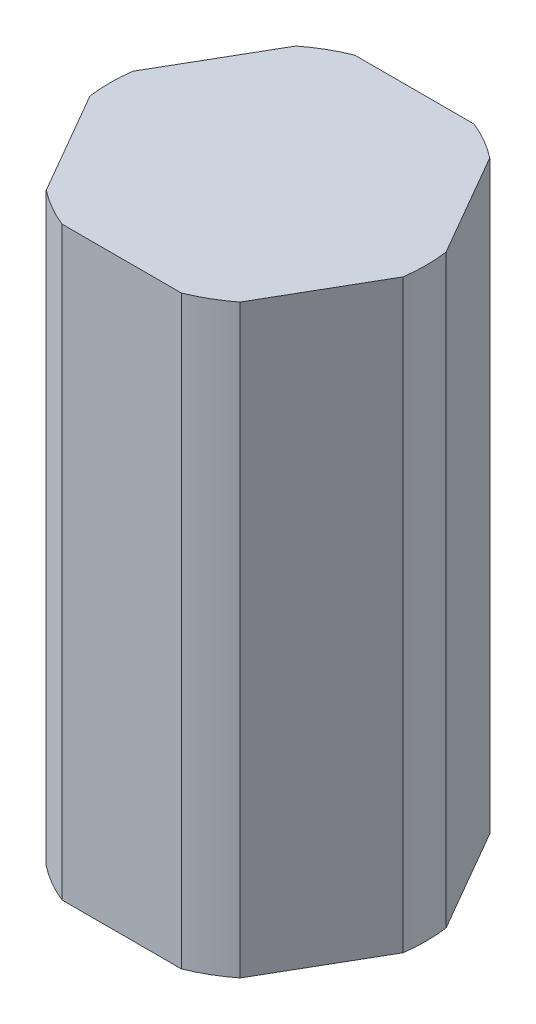
ISO-10303-21;
HEADER;
FILE_DESCRIPTION(('STEP AP214'),'2;1');
FILE_NAME('part.step','',(''),(''),'','','');
FILE_SCHEMA(('AUTOMOTIVE_DESIGN { 1 0 10303 214 1 1 1 1 }'));
ENDSEC;
DATA;
#1=APPLICATION_CONTEXT('core data for automotive mechanical design processes');
#2=APPLICATION_PROTOCOL_DEFINITION('international standard','automotive_design',2000,#1);
#3=PRODUCT_CONTEXT('',#1,'mechanical');
#4=PRODUCT('Part','Part','',(#3));
#5=PRODUCT_RELATED_PRODUCT_CATEGORY('part','',(#4));
#6=PRODUCT_DEFINITION_FORMATION('','',#4);
#7=PRODUCT_DEFINITION_CONTEXT('part definition',#1,'design');
#8=PRODUCT_DEFINITION('design','',#6,#7);
#9=PRODUCT_DEFINITION_SHAPE('','',#8);
#10=(LENGTH_UNIT() NAMED_UNIT(*) SI_UNIT(.MILLI.,.METRE.));
#11=(NAMED_UNIT(*) PLANE_ANGLE_UNIT() SI_UNIT($,.RADIAN.));
#12=(NAMED_UNIT(*) SI_UNIT($,.STERADIAN.) SOLID_ANGLE_UNIT());
#13=UNCERTAINTY_MEASURE_WITH_UNIT(LENGTH_MEASURE(1.E-05),#10,'distance_accuracy_value','');
#14=(GEOMETRIC_REPRESENTATION_CONTEXT(3) GLOBAL_UNCERTAINTY_ASSIGNED_CONTEXT((#13)) GLOBAL_UNIT_ASSIGNED_CONTEXT((#10,
#11,#12)) REPRESENTATION_CONTEXT('',''));
#15=CARTESIAN_POINT('',(0.,0.,0.));
#16=DIRECTION('',(0.,0.,1.));
#17=DIRECTION('',(1.,0.,0.));
#18=AXIS2_PLACEMENT_3D('',#15,#16,#17);
#19=CARTESIAN_POINT('',(0.,10.,2.5));
#20=DIRECTION('',(0.,0.,-1.));
#21=DIRECTION('',(-1.,0.,0.));
#22=AXIS2_PLACEMENT_3D('',#19,#20,#21);
#23=PLANE('',#22);
#24=DIRECTION('',(1.,0.,0.));
#25=VECTOR('',#24,1.);
#26=CARTESIAN_POINT('',(0.,0.,2.5));
#27=LINE('',#26,#25);
#28=CARTESIAN_POINT('',(-1.01980390271856,0.,2.5));
#29=VERTEX_POINT('',#28);
#30=CARTESIAN_POINT('',(1.01980390271856,0.,2.5));
#31=VERTEX_POINT('',#30);
#32=EDGE_CURVE('E154',#29,#31,#27,.T.);
#33=ORIENTED_EDGE('',*,*,#32,.T.);
#34=DIRECTION('',(0.,-1.,0.));
#35=VECTOR('',#34,1.);
#36=CARTESIAN_POINT('',(1.01980390271856,10.,2.5));
#37=LINE('',#36,#35);
#38=CARTESIAN_POINT('',(1.01980390271856,10.,2.5));
#39=VERTEX_POINT('',#38);
#40=EDGE_CURVE('E11',#39,#31,#37,.T.);
#41=ORIENTED_EDGE('',*,*,#40,.F.);
#42=DIRECTION('',(1.,0.,0.));
#43=VECTOR('',#42,1.);
#44=CARTESIAN_POINT('',(0.,10.,2.5));
#45=LINE('',#44,#43);
#46=CARTESIAN_POINT('',(-1.01980390271856,10.,2.5));
#47=VERTEX_POINT('',#46);
#48=EDGE_CURVE('E211',#47,#39,#45,.T.);
#49=ORIENTED_EDGE('',*,*,#48,.F.);
#50=DIRECTION('',(0.,-1.,0.));
#51=VECTOR('',#50,1.);
#52=CARTESIAN_POINT('',(-1.01980390271856,10.,2.5));
#53=LINE('',#52,#51);
#54=EDGE_CURVE('E150',#47,#29,#53,.T.);
#55=ORIENTED_EDGE('',*,*,#54,.T.);
#56=EDGE_LOOP('',(#33,#41,#49,#55));
#57=FACE_BOUND('',#56,.T.);
#58=ADVANCED_FACE('F33',(#57),#23,.F.);
#59=CARTESIAN_POINT('',(0.,10.,0.));
#60=DIRECTION('',(0.,-1.,0.));
#61=DIRECTION('',(0.,0.,-1.));
#62=AXIS2_PLACEMENT_3D('',#59,#60,#61);
#63=CYLINDRICAL_SURFACE('',#62,2.7);
#64=CARTESIAN_POINT('',(0.,0.,0.));
#65=DIRECTION('',(0.,1.,0.));
#66=DIRECTION('',(0.,0.,1.));
#67=AXIS2_PLACEMENT_3D('',#64,#65,#66);
#68=CIRCLE('',#67,2.7);
#69=CARTESIAN_POINT('',(1.65516155810182,0.,2.13317608663278));
#70=VERTEX_POINT('',#69);
#71=EDGE_CURVE('E157',#31,#70,#68,.T.);
#72=ORIENTED_EDGE('',*,*,#71,.T.);
#73=DIRECTION('',(0.,-1.,0.));
#74=VECTOR('',#73,1.);
#75=CARTESIAN_POINT('',(1.65516155810182,10.,2.13317608663278));
#76=LINE('',#75,#74);
#77=CARTESIAN_POINT('',(1.65516155810182,10.,2.13317608663278));
#78=VERTEX_POINT('',#77);
#79=EDGE_CURVE('E41',#78,#70,#76,.T.);
#80=ORIENTED_EDGE('',*,*,#79,.F.);
#81=CARTESIAN_POINT('',(0.,10.,0.));
#82=DIRECTION('',(0.,1.,0.));
#83=DIRECTION('',(0.,0.,1.));
#84=AXIS2_PLACEMENT_3D('',#81,#82,#83);
#85=CIRCLE('',#84,2.7);
#86=EDGE_CURVE('E104',#39,#78,#85,.T.);
#87=ORIENTED_EDGE('',*,*,#86,.F.);
#88=ORIENTED_EDGE('',*,*,#40,.T.);
#89=EDGE_LOOP('',(#72,#80,#87,#88));
#90=FACE_BOUND('',#89,.T.);
#91=ADVANCED_FACE('F243',(#90),#63,.T.);
#92=CARTESIAN_POINT('',(2.1650635094611,10.,1.25));
#93=DIRECTION('',(-0.866025403784439,0.,-0.5));
#94=DIRECTION('',(-0.5,0.,0.866025403784439));
#95=AXIS2_PLACEMENT_3D('',#92,#93,#94);
#96=PLANE('',#95);
#97=DIRECTION('',(0.5,0.,-0.866025403784439));
#98=VECTOR('',#97,1.);
#99=CARTESIAN_POINT('',(2.1650635094611,0.,1.25));
#100=LINE('',#99,#98);
#101=CARTESIAN_POINT('',(2.67496546082038,0.,0.366823913367216));
#102=VERTEX_POINT('',#101);
#103=EDGE_CURVE('E159',#70,#102,#100,.T.);
#104=ORIENTED_EDGE('',*,*,#103,.T.);
#105=DIRECTION('',(0.,-1.,0.));
#106=VECTOR('',#105,1.);
#107=CARTESIAN_POINT('',(2.67496546082038,10.,0.366823913367216));
#108=LINE('',#107,#106);
#109=CARTESIAN_POINT('',(2.67496546082038,10.,0.366823913367216));
#110=VERTEX_POINT('',#109);
#111=EDGE_CURVE('E189',#110,#102,#108,.T.);
#112=ORIENTED_EDGE('',*,*,#111,.F.);
#113=DIRECTION('',(0.5,0.,-0.866025403784439));
#114=VECTOR('',#113,1.);
#115=CARTESIAN_POINT('',(2.1650635094611,10.,1.25));
#116=LINE('',#115,#114);
#117=EDGE_CURVE('E197',#78,#110,#116,.T.);
#118=ORIENTED_EDGE('',*,*,#117,.F.);
#119=ORIENTED_EDGE('',*,*,#79,.T.);
#120=EDGE_LOOP('',(#104,#112,#118,#119));
#121=FACE_BOUND('',#120,.T.);
#122=ADVANCED_FACE('F195',(#121),#96,.F.);
#123=CARTESIAN_POINT('',(2.67496546082038,0.,-0.366823913367218));
#124=VERTEX_POINT('',#123);
#125=EDGE_CURVE('E160',#102,#124,#68,.T.);
#126=ORIENTED_EDGE('',*,*,#125,.T.);
#127=DIRECTION('',(0.,-1.,0.));
#128=VECTOR('',#127,1.);
#129=CARTESIAN_POINT('',(2.67496546082038,10.,-0.366823913367218));
#130=LINE('',#129,#128);
#131=CARTESIAN_POINT('',(2.67496546082038,10.,-0.366823913367218));
#132=VERTEX_POINT('',#131);
#133=EDGE_CURVE('E186',#132,#124,#130,.T.);
#134=ORIENTED_EDGE('',*,*,#133,.F.);
#135=EDGE_CURVE('E215',#110,#132,#85,.T.);
#136=ORIENTED_EDGE('',*,*,#135,.F.);
#137=ORIENTED_EDGE('',*,*,#111,.T.);
#138=EDGE_LOOP('',(#126,#134,#136,#137));
#139=FACE_BOUND('',#138,.T.);
#140=ADVANCED_FACE('F227',(#139),#63,.T.);
#141=CARTESIAN_POINT('',(2.1650635094611,10.,-1.25));
#142=DIRECTION('',(-0.866025403784438,0.,0.5));
#143=DIRECTION('',(0.5,0.,0.866025403784438));
#144=AXIS2_PLACEMENT_3D('',#141,#142,#143);
#145=PLANE('',#144);
#146=DIRECTION('',(-0.5,0.,-0.866025403784439));
#147=VECTOR('',#146,1.);
#148=CARTESIAN_POINT('',(2.1650635094611,0.,-1.25));
#149=LINE('',#148,#147);
#150=CARTESIAN_POINT('',(1.65516155810182,0.,-2.13317608663278));
#151=VERTEX_POINT('',#150);
#152=EDGE_CURVE('E162',#124,#151,#149,.T.);
#153=ORIENTED_EDGE('',*,*,#152,.T.);
#154=DIRECTION('',(0.,-1.,0.));
#155=VECTOR('',#154,1.);
#156=CARTESIAN_POINT('',(1.65516155810182,10.,-2.13317608663278));
#157=LINE('',#156,#155);
#158=CARTESIAN_POINT('',(1.65516155810182,10.,-2.13317608663278));
#159=VERTEX_POINT('',#158);
#160=EDGE_CURVE('E183',#159,#151,#157,.T.);
#161=ORIENTED_EDGE('',*,*,#160,.F.);
#162=DIRECTION('',(-0.5,0.,-0.866025403784439));
#163=VECTOR('',#162,1.);
#164=CARTESIAN_POINT('',(2.1650635094611,10.,-1.25));
#165=LINE('',#164,#163);
#166=EDGE_CURVE('E218',#132,#159,#165,.T.);
#167=ORIENTED_EDGE('',*,*,#166,.F.);
#168=ORIENTED_EDGE('',*,*,#133,.T.);
#169=EDGE_LOOP('',(#153,#161,#167,#168));
#170=FACE_BOUND('',#169,.T.);
#171=ADVANCED_FACE('F229',(#170),#145,.F.);
#172=CARTESIAN_POINT('',(1.01980390271855,0.,-2.5));
#173=VERTEX_POINT('',#172);
#174=EDGE_CURVE('E164',#151,#173,#68,.T.);
#175=ORIENTED_EDGE('',*,*,#174,.T.);
#176=DIRECTION('',(0.,-1.,0.));
#177=VECTOR('',#176,1.);
#178=CARTESIAN_POINT('',(1.01980390271855,10.,-2.5));
#179=LINE('',#178,#177);
#180=CARTESIAN_POINT('',(1.01980390271855,10.,-2.5));
#181=VERTEX_POINT('',#180);
#182=EDGE_CURVE('E180',#181,#173,#179,.T.);
#183=ORIENTED_EDGE('',*,*,#182,.F.);
#184=EDGE_CURVE('E219',#159,#181,#85,.T.);
#185=ORIENTED_EDGE('',*,*,#184,.F.);
#186=ORIENTED_EDGE('',*,*,#160,.T.);
#187=EDGE_LOOP('',(#175,#183,#185,#186));
#188=FACE_BOUND('',#187,.T.);
#189=ADVANCED_FACE('F230',(#188),#63,.T.);
#190=CARTESIAN_POINT('',(0.,10.,-2.5));
#191=DIRECTION('',(0.,0.,1.));
#192=DIRECTION('',(1.,0.,0.));
#193=AXIS2_PLACEMENT_3D('',#190,#191,#192);
#194=PLANE('',#193);
#195=DIRECTION('',(-1.,0.,0.));
#196=VECTOR('',#195,1.);
#197=CARTESIAN_POINT('',(0.,0.,-2.5));
#198=LINE('',#197,#196);
#199=CARTESIAN_POINT('',(-1.01980390271855,0.,-2.5));
#200=VERTEX_POINT('',#199);
#201=EDGE_CURVE('E165',#173,#200,#198,.T.);
#202=ORIENTED_EDGE('',*,*,#201,.T.);
#203=DIRECTION('',(0.,-1.,0.));
#204=VECTOR('',#203,1.);
#205=CARTESIAN_POINT('',(-1.01980390271855,10.,-2.5));
#206=LINE('',#205,#204);
#207=CARTESIAN_POINT('',(-1.01980390271855,10.,-2.5));
#208=VERTEX_POINT('',#207);
#209=EDGE_CURVE('E177',#208,#200,#206,.T.);
#210=ORIENTED_EDGE('',*,*,#209,.F.);
#211=DIRECTION('',(-1.,0.,0.));
#212=VECTOR('',#211,1.);
#213=CARTESIAN_POINT('',(0.,10.,-2.5));
#214=LINE('',#213,#212);
#215=EDGE_CURVE('E220',#181,#208,#214,.T.);
#216=ORIENTED_EDGE('',*,*,#215,.F.);
#217=ORIENTED_EDGE('',*,*,#182,.T.);
#218=EDGE_LOOP('',(#202,#210,#216,#217));
#219=FACE_BOUND('',#218,.T.);
#220=ADVANCED_FACE('F233',(#219),#194,.F.);
#221=CARTESIAN_POINT('',(-1.65516155810182,0.,-2.13317608663278));
#222=VERTEX_POINT('',#221);
#223=EDGE_CURVE('E167',#200,#222,#68,.T.);
#224=ORIENTED_EDGE('',*,*,#223,.T.);
#225=DIRECTION('',(0.,-1.,0.));
#226=VECTOR('',#225,1.);
#227=CARTESIAN_POINT('',(-1.65516155810182,10.,-2.13317608663278));
#228=LINE('',#227,#226);
#229=CARTESIAN_POINT('',(-1.65516155810182,10.,-2.13317608663278));
#230=VERTEX_POINT('',#229);
#231=EDGE_CURVE('E174',#230,#222,#228,.T.);
#232=ORIENTED_EDGE('',*,*,#231,.F.);
#233=EDGE_CURVE('E140',#208,#230,#85,.T.);
#234=ORIENTED_EDGE('',*,*,#233,.F.);
#235=ORIENTED_EDGE('',*,*,#209,.T.);
#236=EDGE_LOOP('',(#224,#232,#234,#235));
#237=FACE_BOUND('',#236,.T.);
#238=ADVANCED_FACE('F235',(#237),#63,.T.);
#239=CARTESIAN_POINT('',(-2.1650635094611,10.,-1.25));
#240=DIRECTION('',(0.866025403784439,0.,0.5));
#241=DIRECTION('',(0.5,0.,-0.866025403784439));
#242=AXIS2_PLACEMENT_3D('',#239,#240,#241);
#243=PLANE('',#242);
#244=DIRECTION('',(-0.5,0.,0.866025403784439));
#245=VECTOR('',#244,1.);
#246=CARTESIAN_POINT('',(-2.1650635094611,0.,-1.25));
#247=LINE('',#246,#245);
#248=CARTESIAN_POINT('',(-2.67496546082038,0.,-0.366823913367215));
#249=VERTEX_POINT('',#248);
#250=EDGE_CURVE('E168',#222,#249,#247,.T.);
#251=ORIENTED_EDGE('',*,*,#250,.T.);
#252=DIRECTION('',(0.,-1.,0.));
#253=VECTOR('',#252,1.);
#254=CARTESIAN_POINT('',(-2.67496546082038,10.,-0.366823913367215));
#255=LINE('',#254,#253);
#256=CARTESIAN_POINT('',(-2.67496546082038,10.,-0.366823913367215));
#257=VERTEX_POINT('',#256);
#258=EDGE_CURVE('E145',#257,#249,#255,.T.);
#259=ORIENTED_EDGE('',*,*,#258,.F.);
#260=DIRECTION('',(-0.5,0.,0.866025403784439));
#261=VECTOR('',#260,1.);
#262=CARTESIAN_POINT('',(-2.1650635094611,10.,-1.25));
#263=LINE('',#262,#261);
#264=EDGE_CURVE('E135',#230,#257,#263,.T.);
#265=ORIENTED_EDGE('',*,*,#264,.F.);
#266=ORIENTED_EDGE('',*,*,#231,.T.);
#267=EDGE_LOOP('',(#251,#259,#265,#266));
#268=FACE_BOUND('',#267,.T.);
#269=ADVANCED_FACE('F238',(#268),#243,.F.);
#270=CARTESIAN_POINT('',(-2.67496546082038,0.,0.366823913367219));
#271=VERTEX_POINT('',#270);
#272=EDGE_CURVE('E144',#249,#271,#68,.T.);
#273=ORIENTED_EDGE('',*,*,#272,.T.);
#274=DIRECTION('',(0.,-1.,0.));
#275=VECTOR('',#274,1.);
#276=CARTESIAN_POINT('',(-2.67496546082038,10.,0.366823913367219));
#277=LINE('',#276,#275);
#278=CARTESIAN_POINT('',(-2.67496546082038,10.,0.366823913367219));
#279=VERTEX_POINT('',#278);
#280=EDGE_CURVE('E141',#279,#271,#277,.T.);
#281=ORIENTED_EDGE('',*,*,#280,.F.);
#282=EDGE_CURVE('E129',#257,#279,#85,.T.);
#283=ORIENTED_EDGE('',*,*,#282,.F.);
#284=ORIENTED_EDGE('',*,*,#258,.T.);
#285=EDGE_LOOP('',(#273,#281,#283,#284));
#286=FACE_BOUND('',#285,.T.);
#287=ADVANCED_FACE('F142',(#286),#63,.T.);
#288=CARTESIAN_POINT('',(-2.1650635094611,10.,1.25));
#289=DIRECTION('',(0.866025403784439,0.,-0.5));
#290=DIRECTION('',(-0.5,0.,-0.866025403784439));
#291=AXIS2_PLACEMENT_3D('',#288,#289,#290);
#292=PLANE('',#291);
#293=DIRECTION('',(0.5,0.,0.866025403784439));
#294=VECTOR('',#293,1.);
#295=CARTESIAN_POINT('',(-2.1650635094611,0.,1.25));
#296=LINE('',#295,#294);
#297=CARTESIAN_POINT('',(-1.65516155810182,0.,2.13317608663278));
#298=VERTEX_POINT('',#297);
#299=EDGE_CURVE('E90',#271,#298,#296,.T.);
#300=ORIENTED_EDGE('',*,*,#299,.T.);
#301=DIRECTION('',(0.,-1.,0.));
#302=VECTOR('',#301,1.);
#303=CARTESIAN_POINT('',(-1.65516155810182,10.,2.13317608663278));
#304=LINE('',#303,#302);
#305=CARTESIAN_POINT('',(-1.65516155810182,10.,2.13317608663278));
#306=VERTEX_POINT('',#305);
#307=EDGE_CURVE('E146',#306,#298,#304,.T.);
#308=ORIENTED_EDGE('',*,*,#307,.F.);
#309=DIRECTION('',(0.5,0.,0.866025403784439));
#310=VECTOR('',#309,1.);
#311=CARTESIAN_POINT('',(-2.1650635094611,10.,1.25));
#312=LINE('',#311,#310);
#313=EDGE_CURVE('E133',#279,#306,#312,.T.);
#314=ORIENTED_EDGE('',*,*,#313,.F.);
#315=ORIENTED_EDGE('',*,*,#280,.T.);
#316=EDGE_LOOP('',(#300,#308,#314,#315));
#317=FACE_BOUND('',#316,.T.);
#318=ADVANCED_FACE('F148',(#317),#292,.F.);
#319=EDGE_CURVE('E96',#298,#29,#68,.T.);
#320=ORIENTED_EDGE('',*,*,#319,.T.);
#321=ORIENTED_EDGE('',*,*,#54,.F.);
#322=EDGE_CURVE('E49',#306,#47,#85,.T.);
#323=ORIENTED_EDGE('',*,*,#322,.F.);
#324=ORIENTED_EDGE('',*,*,#307,.T.);
#325=EDGE_LOOP('',(#320,#321,#323,#324));
#326=FACE_BOUND('',#325,.T.);
#327=ADVANCED_FACE('F240',(#326),#63,.T.);
#328=CARTESIAN_POINT('',(0.,10.,0.));
#329=DIRECTION('',(0.,1.,0.));
#330=DIRECTION('',(0.,0.,1.));
#331=AXIS2_PLACEMENT_3D('',#328,#329,#330);
#332=PLANE('',#331);
#333=ORIENTED_EDGE('',*,*,#48,.T.);
#334=ORIENTED_EDGE('',*,*,#86,.T.);
#335=ORIENTED_EDGE('',*,*,#117,.T.);
#336=ORIENTED_EDGE('',*,*,#135,.T.);
#337=ORIENTED_EDGE('',*,*,#166,.T.);
#338=ORIENTED_EDGE('',*,*,#184,.T.);
#339=ORIENTED_EDGE('',*,*,#215,.T.);
#340=ORIENTED_EDGE('',*,*,#233,.T.);
#341=ORIENTED_EDGE('',*,*,#264,.T.);
#342=ORIENTED_EDGE('',*,*,#282,.T.);
#343=ORIENTED_EDGE('',*,*,#313,.T.);
#344=ORIENTED_EDGE('',*,*,#322,.T.);
#345=EDGE_LOOP('',(#333,#334,#335,#336,#337,#338,#339,#340,#341,#342,#343,#344));
#346=FACE_BOUND('',#345,.T.);
#347=ADVANCED_FACE('F131',(#346),#332,.T.);
#348=CARTESIAN_POINT('',(0.,0.,0.));
#349=DIRECTION('',(0.,1.,0.));
#350=DIRECTION('',(0.,0.,1.));
#351=AXIS2_PLACEMENT_3D('',#348,#349,#350);
#352=PLANE('',#351);
#353=ORIENTED_EDGE('',*,*,#32,.F.);
#354=ORIENTED_EDGE('',*,*,#319,.F.);
#355=ORIENTED_EDGE('',*,*,#299,.F.);
#356=ORIENTED_EDGE('',*,*,#272,.F.);
#357=ORIENTED_EDGE('',*,*,#250,.F.);
#358=ORIENTED_EDGE('',*,*,#223,.F.);
#359=ORIENTED_EDGE('',*,*,#201,.F.);
#360=ORIENTED_EDGE('',*,*,#174,.F.);
#361=ORIENTED_EDGE('',*,*,#152,.F.);
#362=ORIENTED_EDGE('',*,*,#125,.F.);
#363=ORIENTED_EDGE('',*,*,#103,.F.);
#364=ORIENTED_EDGE('',*,*,#71,.F.);
#365=EDGE_LOOP('',(#353,#354,#355,#356,#357,#358,#359,#360,#361,#362,#363,#364));
#366=FACE_BOUND('',#365,.T.);
#367=ADVANCED_FACE('F201',(#366),#352,.F.);
#368=CLOSED_SHELL('',(#58,#91,#122,#140,#171,#189,#220,#238,#269,#287,#318,#327,#347,#367));
#369=MANIFOLD_SOLID_BREP('B2',#368);
#370=ADVANCED_BREP_SHAPE_REPRESENTATION('',(#18,#369),#14);
#371=SHAPE_DEFINITION_REPRESENTATION(#9,#370);
ENDSEC;
END-ISO-10303-21;
